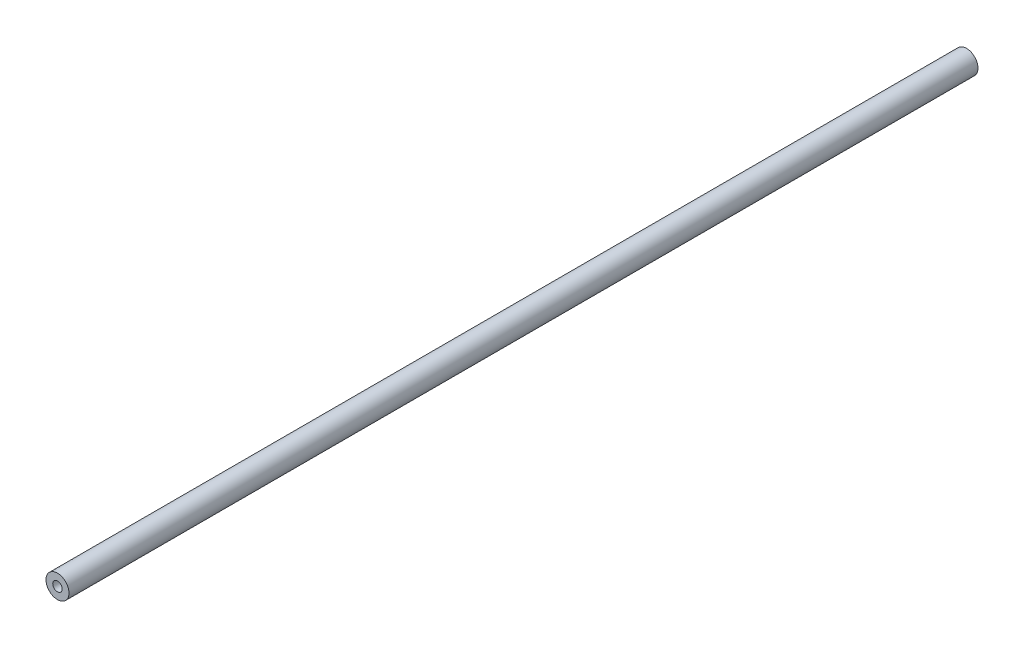
ISO-10303-21;
HEADER;
FILE_DESCRIPTION(('STEP AP214'),'2;1');
FILE_NAME('part.step','',(''),(''),'','','');
FILE_SCHEMA(('AUTOMOTIVE_DESIGN { 1 0 10303 214 1 1 1 1 }'));
ENDSEC;
DATA;
#1=APPLICATION_CONTEXT('core data for automotive mechanical design processes');
#2=APPLICATION_PROTOCOL_DEFINITION('international standard','automotive_design',2000,#1);
#3=PRODUCT_CONTEXT('',#1,'mechanical');
#4=PRODUCT('Part','Part','',(#3));
#5=PRODUCT_RELATED_PRODUCT_CATEGORY('part','',(#4));
#6=PRODUCT_DEFINITION_FORMATION('','',#4);
#7=PRODUCT_DEFINITION_CONTEXT('part definition',#1,'design');
#8=PRODUCT_DEFINITION('design','',#6,#7);
#9=PRODUCT_DEFINITION_SHAPE('','',#8);
#10=(LENGTH_UNIT() NAMED_UNIT(*) SI_UNIT(.MILLI.,.METRE.));
#11=(NAMED_UNIT(*) PLANE_ANGLE_UNIT() SI_UNIT($,.RADIAN.));
#12=(NAMED_UNIT(*) SI_UNIT($,.STERADIAN.) SOLID_ANGLE_UNIT());
#13=UNCERTAINTY_MEASURE_WITH_UNIT(LENGTH_MEASURE(1.E-05),#10,'distance_accuracy_value','');
#14=(GEOMETRIC_REPRESENTATION_CONTEXT(3) GLOBAL_UNCERTAINTY_ASSIGNED_CONTEXT((#13)) GLOBAL_UNIT_ASSIGNED_CONTEXT((#10,
#11,#12)) REPRESENTATION_CONTEXT('',''));
#15=CARTESIAN_POINT('',(0.,0.,0.));
#16=DIRECTION('',(0.,0.,1.));
#17=DIRECTION('',(1.,0.,0.));
#18=AXIS2_PLACEMENT_3D('',#15,#16,#17);
#19=CARTESIAN_POINT('',(0.,0.,158.));
#20=DIRECTION('',(0.,0.,-1.));
#21=DIRECTION('',(-1.,0.,0.));
#22=AXIS2_PLACEMENT_3D('',#19,#20,#21);
#23=CYLINDRICAL_SURFACE('',#22,4.);
#24=CARTESIAN_POINT('',(0.,0.,158.));
#25=DIRECTION('',(0.,0.,1.));
#26=DIRECTION('',(1.,0.,0.));
#27=AXIS2_PLACEMENT_3D('',#24,#25,#26);
#28=CIRCLE('',#27,4.);
#29=CARTESIAN_POINT('',(4.,0.,158.));
#30=VERTEX_POINT('',#29);
#31=EDGE_CURVE('E11',#30,#30,#28,.T.);
#32=ORIENTED_EDGE('',*,*,#31,.F.);
#33=EDGE_LOOP('',(#32));
#34=FACE_BOUND('',#33,.T.);
#35=CARTESIAN_POINT('',(0.,0.,-158.));
#36=DIRECTION('',(0.,0.,1.));
#37=DIRECTION('',(1.,0.,0.));
#38=AXIS2_PLACEMENT_3D('',#35,#36,#37);
#39=CIRCLE('',#38,4.);
#40=CARTESIAN_POINT('',(4.,0.,-158.));
#41=VERTEX_POINT('',#40);
#42=EDGE_CURVE('E40',#41,#41,#39,.T.);
#43=ORIENTED_EDGE('',*,*,#42,.T.);
#44=EDGE_LOOP('',(#43));
#45=FACE_BOUND('',#44,.T.);
#46=ADVANCED_FACE('F37',(#34,#45),#23,.T.);
#47=CARTESIAN_POINT('',(0.,0.,158.));
#48=DIRECTION('',(0.,0.,1.));
#49=DIRECTION('',(1.,0.,0.));
#50=AXIS2_PLACEMENT_3D('',#47,#48,#49);
#51=PLANE('',#50);
#52=CARTESIAN_POINT('',(0.,0.,158.));
#53=DIRECTION('',(0.,0.,1.));
#54=DIRECTION('',(1.,0.,0.));
#55=AXIS2_PLACEMENT_3D('',#52,#53,#54);
#56=CIRCLE('',#55,1.65);
#57=CARTESIAN_POINT('',(1.65,0.,158.));
#58=VERTEX_POINT('',#57);
#59=EDGE_CURVE('E61',#58,#58,#56,.T.);
#60=ORIENTED_EDGE('',*,*,#59,.F.);
#61=EDGE_LOOP('',(#60));
#62=FACE_BOUND('',#61,.T.);
#63=ORIENTED_EDGE('',*,*,#31,.T.);
#64=EDGE_LOOP('',(#63));
#65=FACE_BOUND('',#64,.T.);
#66=ADVANCED_FACE('F79',(#62,#65),#51,.T.);
#67=CARTESIAN_POINT('',(0.,0.,-158.));
#68=DIRECTION('',(0.,0.,1.));
#69=DIRECTION('',(1.,0.,0.));
#70=AXIS2_PLACEMENT_3D('',#67,#68,#69);
#71=PLANE('',#70);
#72=CARTESIAN_POINT('',(0.,0.,-158.));
#73=DIRECTION('',(0.,0.,-1.));
#74=DIRECTION('',(-1.,0.,0.));
#75=AXIS2_PLACEMENT_3D('',#72,#73,#74);
#76=CIRCLE('',#75,1.65);
#77=CARTESIAN_POINT('',(-1.65,0.,-158.));
#78=VERTEX_POINT('',#77);
#79=EDGE_CURVE('E60',#78,#78,#76,.T.);
#80=ORIENTED_EDGE('',*,*,#79,.F.);
#81=EDGE_LOOP('',(#80));
#82=FACE_BOUND('',#81,.T.);
#83=ORIENTED_EDGE('',*,*,#42,.F.);
#84=EDGE_LOOP('',(#83));
#85=FACE_BOUND('',#84,.T.);
#86=ADVANCED_FACE('F76',(#82,#85),#71,.F.);
#87=CARTESIAN_POINT('',(0.,0.,-139.));
#88=DIRECTION('',(0.,0.,-1.));
#89=DIRECTION('',(-1.,0.,0.));
#90=AXIS2_PLACEMENT_3D('',#87,#88,#89);
#91=CONICAL_SURFACE('',#90,1.65,1.02974425867665);
#92=CARTESIAN_POINT('',(0.,0.,-138.008579978605));
#93=VERTEX_POINT('',#92);
#94=VERTEX_LOOP('',#93);
#95=FACE_BOUND('',#94,.T.);
#96=CARTESIAN_POINT('',(0.,0.,-139.));
#97=DIRECTION('',(0.,0.,-1.));
#98=DIRECTION('',(-1.,0.,0.));
#99=AXIS2_PLACEMENT_3D('',#96,#97,#98);
#100=CIRCLE('',#99,1.65);
#101=CARTESIAN_POINT('',(-1.65,0.,-139.));
#102=VERTEX_POINT('',#101);
#103=EDGE_CURVE('E64',#102,#102,#100,.T.);
#104=ORIENTED_EDGE('',*,*,#103,.T.);
#105=EDGE_LOOP('',(#104));
#106=FACE_BOUND('',#105,.T.);
#107=ADVANCED_FACE('F78',(#95,#106),#91,.F.);
#108=CARTESIAN_POINT('',(0.,0.,-158.));
#109=DIRECTION('',(0.,0.,-1.));
#110=DIRECTION('',(-1.,0.,0.));
#111=AXIS2_PLACEMENT_3D('',#108,#109,#110);
#112=CYLINDRICAL_SURFACE('',#111,1.65);
#113=ORIENTED_EDGE('',*,*,#103,.F.);
#114=EDGE_LOOP('',(#113));
#115=FACE_BOUND('',#114,.T.);
#116=ORIENTED_EDGE('',*,*,#79,.T.);
#117=EDGE_LOOP('',(#116));
#118=FACE_BOUND('',#117,.T.);
#119=ADVANCED_FACE('F54',(#115,#118),#112,.F.);
#120=CARTESIAN_POINT('',(0.,0.,139.));
#121=DIRECTION('',(0.,0.,1.));
#122=DIRECTION('',(1.,0.,0.));
#123=AXIS2_PLACEMENT_3D('',#120,#121,#122);
#124=CONICAL_SURFACE('',#123,1.65,1.02974425867665);
#125=CARTESIAN_POINT('',(0.,0.,138.008579978605));
#126=VERTEX_POINT('',#125);
#127=VERTEX_LOOP('',#126);
#128=FACE_BOUND('',#127,.T.);
#129=CARTESIAN_POINT('',(0.,0.,139.));
#130=DIRECTION('',(0.,0.,1.));
#131=DIRECTION('',(1.,0.,0.));
#132=AXIS2_PLACEMENT_3D('',#129,#130,#131);
#133=CIRCLE('',#132,1.65);
#134=CARTESIAN_POINT('',(1.65,0.,139.));
#135=VERTEX_POINT('',#134);
#136=EDGE_CURVE('E58',#135,#135,#133,.T.);
#137=ORIENTED_EDGE('',*,*,#136,.T.);
#138=EDGE_LOOP('',(#137));
#139=FACE_BOUND('',#138,.T.);
#140=ADVANCED_FACE('F50',(#128,#139),#124,.F.);
#141=CARTESIAN_POINT('',(0.,0.,158.));
#142=DIRECTION('',(0.,0.,1.));
#143=DIRECTION('',(1.,0.,0.));
#144=AXIS2_PLACEMENT_3D('',#141,#142,#143);
#145=CYLINDRICAL_SURFACE('',#144,1.65);
#146=ORIENTED_EDGE('',*,*,#136,.F.);
#147=EDGE_LOOP('',(#146));
#148=FACE_BOUND('',#147,.T.);
#149=ORIENTED_EDGE('',*,*,#59,.T.);
#150=EDGE_LOOP('',(#149));
#151=FACE_BOUND('',#150,.T.);
#152=ADVANCED_FACE('F53',(#148,#151),#145,.F.);
#153=CLOSED_SHELL('',(#46,#66,#86,#107,#119,#140,#152));
#154=MANIFOLD_SOLID_BREP('B2',#153);
#155=ADVANCED_BREP_SHAPE_REPRESENTATION('',(#18,#154),#14);
#156=SHAPE_DEFINITION_REPRESENTATION(#9,#155);
ENDSEC;
END-ISO-10303-21;
